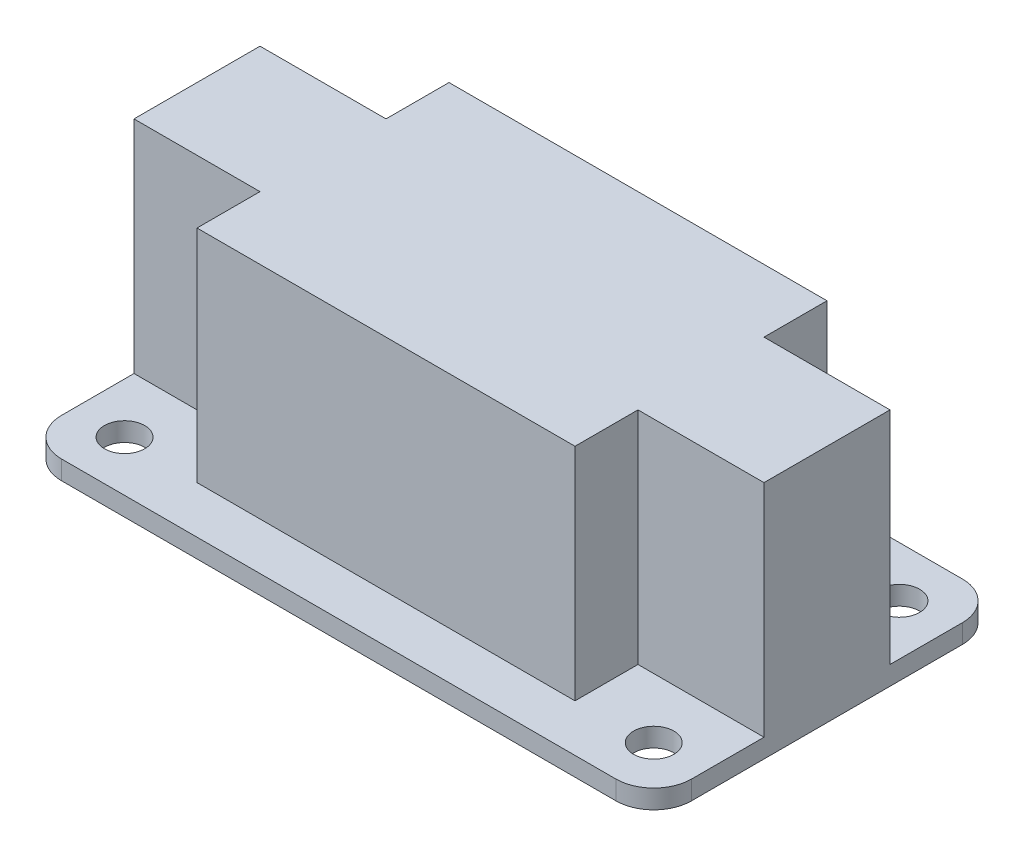
ISO-10303-21;
HEADER;
FILE_DESCRIPTION(('STEP AP214'),'2;1');
FILE_NAME('part.step','',(''),(''),'','','');
FILE_SCHEMA(('AUTOMOTIVE_DESIGN { 1 0 10303 214 1 1 1 1 }'));
ENDSEC;
DATA;
#1=APPLICATION_CONTEXT('core data for automotive mechanical design processes');
#2=APPLICATION_PROTOCOL_DEFINITION('international standard','automotive_design',2000,#1);
#3=PRODUCT_CONTEXT('',#1,'mechanical');
#4=PRODUCT('Part','Part','',(#3));
#5=PRODUCT_RELATED_PRODUCT_CATEGORY('part','',(#4));
#6=PRODUCT_DEFINITION_FORMATION('','',#4);
#7=PRODUCT_DEFINITION_CONTEXT('part definition',#1,'design');
#8=PRODUCT_DEFINITION('design','',#6,#7);
#9=PRODUCT_DEFINITION_SHAPE('','',#8);
#10=(LENGTH_UNIT() NAMED_UNIT(*) SI_UNIT(.MILLI.,.METRE.));
#11=(NAMED_UNIT(*) PLANE_ANGLE_UNIT() SI_UNIT($,.RADIAN.));
#12=(NAMED_UNIT(*) SI_UNIT($,.STERADIAN.) SOLID_ANGLE_UNIT());
#13=UNCERTAINTY_MEASURE_WITH_UNIT(LENGTH_MEASURE(1.E-05),#10,'distance_accuracy_value','');
#14=(GEOMETRIC_REPRESENTATION_CONTEXT(3) GLOBAL_UNCERTAINTY_ASSIGNED_CONTEXT((#13)) GLOBAL_UNIT_ASSIGNED_CONTEXT((#10,
#11,#12)) REPRESENTATION_CONTEXT('',''));
#15=CARTESIAN_POINT('',(0.,0.,0.));
#16=DIRECTION('',(0.,0.,1.));
#17=DIRECTION('',(1.,0.,0.));
#18=AXIS2_PLACEMENT_3D('',#15,#16,#17);
#19=CARTESIAN_POINT('',(0.,1.5,0.));
#20=DIRECTION('',(0.,1.,0.));
#21=DIRECTION('',(0.,0.,1.));
#22=AXIS2_PLACEMENT_3D('',#19,#20,#21);
#23=PLANE('',#22);
#24=DIRECTION('',(1.,0.,0.));
#25=VECTOR('',#24,1.);
#26=CARTESIAN_POINT('',(0.,1.5,-8.75));
#27=LINE('',#26,#25);
#28=CARTESIAN_POINT('',(0.,1.5,-8.75));
#29=VERTEX_POINT('',#28);
#30=CARTESIAN_POINT('',(10.,1.5,-8.75));
#31=VERTEX_POINT('',#30);
#32=EDGE_CURVE('E273',#29,#31,#27,.T.);
#33=ORIENTED_EDGE('',*,*,#32,.F.);
#34=DIRECTION('',(0.,0.,-1.));
#35=VECTOR('',#34,1.);
#36=CARTESIAN_POINT('',(0.,1.5,0.));
#37=LINE('',#36,#35);
#38=CARTESIAN_POINT('',(0.,1.5,-3.));
#39=VERTEX_POINT('',#38);
#40=EDGE_CURVE('E184',#39,#29,#37,.T.);
#41=ORIENTED_EDGE('',*,*,#40,.F.);
#42=CARTESIAN_POINT('',(3.,1.5,-3.));
#43=DIRECTION('',(0.,1.,0.));
#44=DIRECTION('',(0.,0.,1.));
#45=AXIS2_PLACEMENT_3D('',#42,#43,#44);
#46=CIRCLE('',#45,3.);
#47=CARTESIAN_POINT('',(3.,1.5,0.));
#48=VERTEX_POINT('',#47);
#49=EDGE_CURVE('E343',#39,#48,#46,.T.);
#50=ORIENTED_EDGE('',*,*,#49,.T.);
#51=DIRECTION('',(1.,0.,0.));
#52=VECTOR('',#51,1.);
#53=CARTESIAN_POINT('',(0.,1.5,0.));
#54=LINE('',#53,#52);
#55=CARTESIAN_POINT('',(47.,1.5,0.));
#56=VERTEX_POINT('',#55);
#57=EDGE_CURVE('E289',#48,#56,#54,.T.);
#58=ORIENTED_EDGE('',*,*,#57,.T.);
#59=CARTESIAN_POINT('',(47.,1.5,-3.));
#60=DIRECTION('',(0.,1.,0.));
#61=DIRECTION('',(0.,0.,1.));
#62=AXIS2_PLACEMENT_3D('',#59,#60,#61);
#63=CIRCLE('',#62,3.);
#64=CARTESIAN_POINT('',(50.,1.5,-3.));
#65=VERTEX_POINT('',#64);
#66=EDGE_CURVE('E339',#56,#65,#63,.T.);
#67=ORIENTED_EDGE('',*,*,#66,.T.);
#68=DIRECTION('',(0.,0.,-1.));
#69=VECTOR('',#68,1.);
#70=CARTESIAN_POINT('',(50.,1.5,0.));
#71=LINE('',#70,#69);
#72=CARTESIAN_POINT('',(50.,1.5,-8.75));
#73=VERTEX_POINT('',#72);
#74=EDGE_CURVE('E292',#65,#73,#71,.T.);
#75=ORIENTED_EDGE('',*,*,#74,.T.);
#76=DIRECTION('',(-1.,0.,0.));
#77=VECTOR('',#76,1.);
#78=CARTESIAN_POINT('',(0.,1.5,-8.75));
#79=LINE('',#78,#77);
#80=CARTESIAN_POINT('',(40.,1.5,-8.75));
#81=VERTEX_POINT('',#80);
#82=EDGE_CURVE('E263',#73,#81,#79,.T.);
#83=ORIENTED_EDGE('',*,*,#82,.T.);
#84=DIRECTION('',(0.,0.,1.));
#85=VECTOR('',#84,1.);
#86=CARTESIAN_POINT('',(40.,1.5,0.));
#87=LINE('',#86,#85);
#88=CARTESIAN_POINT('',(40.,1.5,-3.75));
#89=VERTEX_POINT('',#88);
#90=EDGE_CURVE('E266',#81,#89,#87,.T.);
#91=ORIENTED_EDGE('',*,*,#90,.T.);
#92=DIRECTION('',(1.,0.,0.));
#93=VECTOR('',#92,1.);
#94=CARTESIAN_POINT('',(0.,1.5,-3.75));
#95=LINE('',#94,#93);
#96=CARTESIAN_POINT('',(10.,1.5,-3.75));
#97=VERTEX_POINT('',#96);
#98=EDGE_CURVE('E269',#97,#89,#95,.T.);
#99=ORIENTED_EDGE('',*,*,#98,.F.);
#100=DIRECTION('',(0.,0.,1.));
#101=VECTOR('',#100,1.);
#102=CARTESIAN_POINT('',(10.,1.5,0.));
#103=LINE('',#102,#101);
#104=EDGE_CURVE('E271',#31,#97,#103,.T.);
#105=ORIENTED_EDGE('',*,*,#104,.F.);
#106=EDGE_LOOP('',(#33,#41,#50,#58,#67,#75,#83,#91,#99,#105));
#107=FACE_BOUND('',#106,.T.);
#108=CARTESIAN_POINT('',(46.,1.5,-4.));
#109=DIRECTION('',(0.,1.,0.));
#110=DIRECTION('',(0.,0.,1.));
#111=AXIS2_PLACEMENT_3D('',#108,#109,#110);
#112=CIRCLE('',#111,1.6);
#113=CARTESIAN_POINT('',(46.,1.5,-2.4));
#114=VERTEX_POINT('',#113);
#115=EDGE_CURVE('E286',#114,#114,#112,.T.);
#116=ORIENTED_EDGE('',*,*,#115,.F.);
#117=EDGE_LOOP('',(#116));
#118=FACE_BOUND('',#117,.T.);
#119=CARTESIAN_POINT('',(4.,1.5,-4.));
#120=DIRECTION('',(0.,1.,0.));
#121=DIRECTION('',(0.,0.,1.));
#122=AXIS2_PLACEMENT_3D('',#119,#120,#121);
#123=CIRCLE('',#122,1.6);
#124=CARTESIAN_POINT('',(4.,1.5,-2.4));
#125=VERTEX_POINT('',#124);
#126=EDGE_CURVE('E283',#125,#125,#123,.T.);
#127=ORIENTED_EDGE('',*,*,#126,.F.);
#128=EDGE_LOOP('',(#127));
#129=FACE_BOUND('',#128,.T.);
#130=ADVANCED_FACE('F41',(#107,#118,#129),#23,.T.);
#131=CARTESIAN_POINT('',(0.,1.5,0.));
#132=DIRECTION('',(0.,0.,-1.));
#133=DIRECTION('',(-1.,0.,0.));
#134=AXIS2_PLACEMENT_3D('',#131,#132,#133);
#135=PLANE('',#134);
#136=ORIENTED_EDGE('',*,*,#57,.F.);
#137=DIRECTION('',(0.,-1.,0.));
#138=VECTOR('',#137,1.);
#139=CARTESIAN_POINT('',(3.,0.,0.));
#140=LINE('',#139,#138);
#141=CARTESIAN_POINT('',(3.,0.,0.));
#142=VERTEX_POINT('',#141);
#143=EDGE_CURVE('E350',#48,#142,#140,.T.);
#144=ORIENTED_EDGE('',*,*,#143,.T.);
#145=DIRECTION('',(1.,0.,0.));
#146=VECTOR('',#145,1.);
#147=CARTESIAN_POINT('',(0.,0.,0.));
#148=LINE('',#147,#146);
#149=CARTESIAN_POINT('',(47.,0.,0.));
#150=VERTEX_POINT('',#149);
#151=EDGE_CURVE('E312',#142,#150,#148,.T.);
#152=ORIENTED_EDGE('',*,*,#151,.T.);
#153=DIRECTION('',(0.,-1.,0.));
#154=VECTOR('',#153,1.);
#155=CARTESIAN_POINT('',(47.,1.5,0.));
#156=LINE('',#155,#154);
#157=EDGE_CURVE('E348',#150,#56,#156,.F.);
#158=ORIENTED_EDGE('',*,*,#157,.T.);
#159=EDGE_LOOP('',(#136,#144,#152,#158));
#160=FACE_BOUND('',#159,.T.);
#161=ADVANCED_FACE('F389',(#160),#135,.F.);
#162=CARTESIAN_POINT('',(50.,1.5,0.));
#163=DIRECTION('',(-1.,0.,0.));
#164=DIRECTION('',(0.,0.,1.));
#165=AXIS2_PLACEMENT_3D('',#162,#163,#164);
#166=PLANE('',#165);
#167=CARTESIAN_POINT('',(50.,1.5,-18.75));
#168=VERTEX_POINT('',#167);
#169=CARTESIAN_POINT('',(50.,1.5,-24.5));
#170=VERTEX_POINT('',#169);
#171=EDGE_CURVE('E64',#168,#170,#71,.T.);
#172=ORIENTED_EDGE('',*,*,#171,.F.);
#173=DIRECTION('',(0.,-1.,0.));
#174=VECTOR('',#173,1.);
#175=CARTESIAN_POINT('',(50.,19.,-18.75));
#176=LINE('',#175,#174);
#177=CARTESIAN_POINT('',(50.,19.,-18.75));
#178=VERTEX_POINT('',#177);
#179=EDGE_CURVE('E236',#178,#168,#176,.T.);
#180=ORIENTED_EDGE('',*,*,#179,.F.);
#181=DIRECTION('',(0.,0.,-1.));
#182=VECTOR('',#181,1.);
#183=CARTESIAN_POINT('',(50.,19.,0.));
#184=LINE('',#183,#182);
#185=CARTESIAN_POINT('',(50.,19.,-8.75));
#186=VERTEX_POINT('',#185);
#187=EDGE_CURVE('E216',#186,#178,#184,.T.);
#188=ORIENTED_EDGE('',*,*,#187,.F.);
#189=DIRECTION('',(0.,-1.,0.));
#190=VECTOR('',#189,1.);
#191=CARTESIAN_POINT('',(50.,19.,-8.75));
#192=LINE('',#191,#190);
#193=EDGE_CURVE('E238',#186,#73,#192,.T.);
#194=ORIENTED_EDGE('',*,*,#193,.T.);
#195=ORIENTED_EDGE('',*,*,#74,.F.);
#196=DIRECTION('',(0.,-1.,0.));
#197=VECTOR('',#196,1.);
#198=CARTESIAN_POINT('',(50.,1.5,-3.));
#199=LINE('',#198,#197);
#200=CARTESIAN_POINT('',(50.,0.,-3.));
#201=VERTEX_POINT('',#200);
#202=EDGE_CURVE('E49',#65,#201,#199,.T.);
#203=ORIENTED_EDGE('',*,*,#202,.T.);
#204=DIRECTION('',(0.,0.,-1.));
#205=VECTOR('',#204,1.);
#206=CARTESIAN_POINT('',(50.,0.,0.));
#207=LINE('',#206,#205);
#208=CARTESIAN_POINT('',(50.,0.,-24.5));
#209=VERTEX_POINT('',#208);
#210=EDGE_CURVE('E315',#201,#209,#207,.T.);
#211=ORIENTED_EDGE('',*,*,#210,.T.);
#212=DIRECTION('',(0.,-1.,0.));
#213=VECTOR('',#212,1.);
#214=CARTESIAN_POINT('',(50.,1.5,-24.5));
#215=LINE('',#214,#213);
#216=EDGE_CURVE('E11',#209,#170,#215,.F.);
#217=ORIENTED_EDGE('',*,*,#216,.T.);
#218=EDGE_LOOP('',(#172,#180,#188,#194,#195,#203,#211,#217));
#219=FACE_BOUND('',#218,.T.);
#220=ADVANCED_FACE('F357',(#219),#166,.F.);
#221=CARTESIAN_POINT('',(0.,1.5,-27.5));
#222=DIRECTION('',(0.,0.,-1.));
#223=DIRECTION('',(-1.,0.,0.));
#224=AXIS2_PLACEMENT_3D('',#221,#222,#223);
#225=PLANE('',#224);
#226=DIRECTION('',(1.,0.,0.));
#227=VECTOR('',#226,1.);
#228=CARTESIAN_POINT('',(0.,0.,-27.5));
#229=LINE('',#228,#227);
#230=CARTESIAN_POINT('',(3.,0.,-27.5));
#231=VERTEX_POINT('',#230);
#232=CARTESIAN_POINT('',(47.,0.,-27.5));
#233=VERTEX_POINT('',#232);
#234=EDGE_CURVE('E317',#231,#233,#229,.T.);
#235=ORIENTED_EDGE('',*,*,#234,.F.);
#236=DIRECTION('',(0.,-1.,0.));
#237=VECTOR('',#236,1.);
#238=CARTESIAN_POINT('',(3.,1.5,-27.5));
#239=LINE('',#238,#237);
#240=CARTESIAN_POINT('',(3.,1.5,-27.5));
#241=VERTEX_POINT('',#240);
#242=EDGE_CURVE('E337',#231,#241,#239,.F.);
#243=ORIENTED_EDGE('',*,*,#242,.T.);
#244=DIRECTION('',(1.,0.,0.));
#245=VECTOR('',#244,1.);
#246=CARTESIAN_POINT('',(0.,1.5,-27.5));
#247=LINE('',#246,#245);
#248=CARTESIAN_POINT('',(47.,1.5,-27.5));
#249=VERTEX_POINT('',#248);
#250=EDGE_CURVE('E295',#241,#249,#247,.T.);
#251=ORIENTED_EDGE('',*,*,#250,.T.);
#252=DIRECTION('',(0.,-1.,0.));
#253=VECTOR('',#252,1.);
#254=CARTESIAN_POINT('',(47.,0.,-27.5));
#255=LINE('',#254,#253);
#256=EDGE_CURVE('E334',#249,#233,#255,.T.);
#257=ORIENTED_EDGE('',*,*,#256,.T.);
#258=EDGE_LOOP('',(#235,#243,#251,#257));
#259=FACE_BOUND('',#258,.T.);
#260=ADVANCED_FACE('F463',(#259),#225,.T.);
#261=CARTESIAN_POINT('',(46.,1.5,-4.));
#262=DIRECTION('',(0.,-1.,0.));
#263=DIRECTION('',(0.,0.,-1.));
#264=AXIS2_PLACEMENT_3D('',#261,#262,#263);
#265=CYLINDRICAL_SURFACE('',#264,1.6);
#266=ORIENTED_EDGE('',*,*,#115,.T.);
#267=EDGE_LOOP('',(#266));
#268=FACE_BOUND('',#267,.T.);
#269=CARTESIAN_POINT('',(46.,0.,-4.));
#270=DIRECTION('',(0.,1.,0.));
#271=DIRECTION('',(0.,0.,1.));
#272=AXIS2_PLACEMENT_3D('',#269,#270,#271);
#273=CIRCLE('',#272,1.6);
#274=CARTESIAN_POINT('',(46.,0.,-2.4));
#275=VERTEX_POINT('',#274);
#276=EDGE_CURVE('E309',#275,#275,#273,.T.);
#277=ORIENTED_EDGE('',*,*,#276,.F.);
#278=EDGE_LOOP('',(#277));
#279=FACE_BOUND('',#278,.T.);
#280=ADVANCED_FACE('F457',(#268,#279),#265,.F.);
#281=CARTESIAN_POINT('',(4.,1.5,-4.));
#282=DIRECTION('',(0.,-1.,0.));
#283=DIRECTION('',(0.,0.,-1.));
#284=AXIS2_PLACEMENT_3D('',#281,#282,#283);
#285=CYLINDRICAL_SURFACE('',#284,1.6);
#286=ORIENTED_EDGE('',*,*,#126,.T.);
#287=EDGE_LOOP('',(#286));
#288=FACE_BOUND('',#287,.T.);
#289=CARTESIAN_POINT('',(4.,0.,-4.));
#290=DIRECTION('',(0.,1.,0.));
#291=DIRECTION('',(0.,0.,1.));
#292=AXIS2_PLACEMENT_3D('',#289,#290,#291);
#293=CIRCLE('',#292,1.6);
#294=CARTESIAN_POINT('',(4.,0.,-2.4));
#295=VERTEX_POINT('',#294);
#296=EDGE_CURVE('E306',#295,#295,#293,.T.);
#297=ORIENTED_EDGE('',*,*,#296,.F.);
#298=EDGE_LOOP('',(#297));
#299=FACE_BOUND('',#298,.T.);
#300=ADVANCED_FACE('F447',(#288,#299),#285,.F.);
#301=CARTESIAN_POINT('',(46.,1.5,-23.5));
#302=DIRECTION('',(0.,-1.,0.));
#303=DIRECTION('',(0.,0.,-1.));
#304=AXIS2_PLACEMENT_3D('',#301,#302,#303);
#305=CYLINDRICAL_SURFACE('',#304,1.6);
#306=CARTESIAN_POINT('',(46.,1.5,-23.5));
#307=DIRECTION('',(0.,1.,0.));
#308=DIRECTION('',(0.,0.,1.));
#309=AXIS2_PLACEMENT_3D('',#306,#307,#308);
#310=CIRCLE('',#309,1.6);
#311=CARTESIAN_POINT('',(46.,1.5,-21.9));
#312=VERTEX_POINT('',#311);
#313=EDGE_CURVE('E279',#312,#312,#310,.T.);
#314=ORIENTED_EDGE('',*,*,#313,.T.);
#315=EDGE_LOOP('',(#314));
#316=FACE_BOUND('',#315,.T.);
#317=CARTESIAN_POINT('',(46.,0.,-23.5));
#318=DIRECTION('',(0.,1.,0.));
#319=DIRECTION('',(0.,0.,1.));
#320=AXIS2_PLACEMENT_3D('',#317,#318,#319);
#321=CIRCLE('',#320,1.6);
#322=CARTESIAN_POINT('',(46.,0.,-21.9));
#323=VERTEX_POINT('',#322);
#324=EDGE_CURVE('E303',#323,#323,#321,.T.);
#325=ORIENTED_EDGE('',*,*,#324,.F.);
#326=EDGE_LOOP('',(#325));
#327=FACE_BOUND('',#326,.T.);
#328=ADVANCED_FACE('F444',(#316,#327),#305,.F.);
#329=CARTESIAN_POINT('',(4.,1.5,-23.5));
#330=DIRECTION('',(0.,-1.,0.));
#331=DIRECTION('',(0.,0.,-1.));
#332=AXIS2_PLACEMENT_3D('',#329,#330,#331);
#333=CYLINDRICAL_SURFACE('',#332,1.6);
#334=CARTESIAN_POINT('',(4.,1.5,-23.5));
#335=DIRECTION('',(0.,1.,0.));
#336=DIRECTION('',(0.,0.,1.));
#337=AXIS2_PLACEMENT_3D('',#334,#335,#336);
#338=CIRCLE('',#337,1.6);
#339=CARTESIAN_POINT('',(4.,1.5,-21.9));
#340=VERTEX_POINT('',#339);
#341=EDGE_CURVE('E276',#340,#340,#338,.T.);
#342=ORIENTED_EDGE('',*,*,#341,.T.);
#343=EDGE_LOOP('',(#342));
#344=FACE_BOUND('',#343,.T.);
#345=CARTESIAN_POINT('',(4.,0.,-23.5));
#346=DIRECTION('',(0.,1.,0.));
#347=DIRECTION('',(0.,0.,1.));
#348=AXIS2_PLACEMENT_3D('',#345,#346,#347);
#349=CIRCLE('',#348,1.6);
#350=CARTESIAN_POINT('',(4.,0.,-21.9));
#351=VERTEX_POINT('',#350);
#352=EDGE_CURVE('E275',#351,#351,#349,.T.);
#353=ORIENTED_EDGE('',*,*,#352,.F.);
#354=EDGE_LOOP('',(#353));
#355=FACE_BOUND('',#354,.T.);
#356=ADVANCED_FACE('F437',(#344,#355),#333,.F.);
#357=CARTESIAN_POINT('',(0.,1.5,0.));
#358=DIRECTION('',(-1.,0.,0.));
#359=DIRECTION('',(0.,0.,1.));
#360=AXIS2_PLACEMENT_3D('',#357,#358,#359);
#361=PLANE('',#360);
#362=ORIENTED_EDGE('',*,*,#40,.T.);
#363=DIRECTION('',(0.,-1.,0.));
#364=VECTOR('',#363,1.);
#365=CARTESIAN_POINT('',(0.,19.,-8.75));
#366=LINE('',#365,#364);
#367=CARTESIAN_POINT('',(0.,19.,-8.75));
#368=VERTEX_POINT('',#367);
#369=EDGE_CURVE('E178',#368,#29,#366,.T.);
#370=ORIENTED_EDGE('',*,*,#369,.F.);
#371=DIRECTION('',(0.,0.,-1.));
#372=VECTOR('',#371,1.);
#373=CARTESIAN_POINT('',(0.,19.,0.));
#374=LINE('',#373,#372);
#375=CARTESIAN_POINT('',(0.,19.,-18.75));
#376=VERTEX_POINT('',#375);
#377=EDGE_CURVE('E182',#368,#376,#374,.T.);
#378=ORIENTED_EDGE('',*,*,#377,.T.);
#379=DIRECTION('',(0.,-1.,0.));
#380=VECTOR('',#379,1.);
#381=CARTESIAN_POINT('',(0.,19.,-18.75));
#382=LINE('',#381,#380);
#383=CARTESIAN_POINT('',(0.,1.5,-18.75));
#384=VERTEX_POINT('',#383);
#385=EDGE_CURVE('E224',#376,#384,#382,.T.);
#386=ORIENTED_EDGE('',*,*,#385,.T.);
#387=CARTESIAN_POINT('',(0.,1.5,-24.5));
#388=VERTEX_POINT('',#387);
#389=EDGE_CURVE('E298',#384,#388,#37,.T.);
#390=ORIENTED_EDGE('',*,*,#389,.T.);
#391=DIRECTION('',(0.,-1.,0.));
#392=VECTOR('',#391,1.);
#393=CARTESIAN_POINT('',(0.,1.5,-24.5));
#394=LINE('',#393,#392);
#395=CARTESIAN_POINT('',(0.,0.,-24.5));
#396=VERTEX_POINT('',#395);
#397=EDGE_CURVE('E322',#388,#396,#394,.T.);
#398=ORIENTED_EDGE('',*,*,#397,.T.);
#399=DIRECTION('',(0.,0.,-1.));
#400=VECTOR('',#399,1.);
#401=CARTESIAN_POINT('',(0.,0.,0.));
#402=LINE('',#401,#400);
#403=CARTESIAN_POINT('',(0.,0.,-3.));
#404=VERTEX_POINT('',#403);
#405=EDGE_CURVE('E280',#404,#396,#402,.T.);
#406=ORIENTED_EDGE('',*,*,#405,.F.);
#407=DIRECTION('',(0.,-1.,0.));
#408=VECTOR('',#407,1.);
#409=CARTESIAN_POINT('',(0.,1.5,-3.));
#410=LINE('',#409,#408);
#411=EDGE_CURVE('E300',#404,#39,#410,.F.);
#412=ORIENTED_EDGE('',*,*,#411,.T.);
#413=EDGE_LOOP('',(#362,#370,#378,#386,#390,#398,#406,#412));
#414=FACE_BOUND('',#413,.T.);
#415=ADVANCED_FACE('F180',(#414),#361,.T.);
#416=DIRECTION('',(-1.,0.,0.));
#417=VECTOR('',#416,1.);
#418=CARTESIAN_POINT('',(0.,1.5,-18.75));
#419=LINE('',#418,#417);
#420=CARTESIAN_POINT('',(40.,1.5,-18.75));
#421=VERTEX_POINT('',#420);
#422=EDGE_CURVE('E261',#168,#421,#419,.T.);
#423=ORIENTED_EDGE('',*,*,#422,.F.);
#424=ORIENTED_EDGE('',*,*,#171,.T.);
#425=CARTESIAN_POINT('',(47.,1.5,-24.5));
#426=DIRECTION('',(0.,1.,0.));
#427=DIRECTION('',(0.,0.,1.));
#428=AXIS2_PLACEMENT_3D('',#425,#426,#427);
#429=CIRCLE('',#428,3.);
#430=EDGE_CURVE('E341',#170,#249,#429,.T.);
#431=ORIENTED_EDGE('',*,*,#430,.T.);
#432=ORIENTED_EDGE('',*,*,#250,.F.);
#433=CARTESIAN_POINT('',(3.,1.5,-24.5));
#434=DIRECTION('',(0.,1.,0.));
#435=DIRECTION('',(0.,0.,1.));
#436=AXIS2_PLACEMENT_3D('',#433,#434,#435);
#437=CIRCLE('',#436,3.);
#438=EDGE_CURVE('E345',#241,#388,#437,.T.);
#439=ORIENTED_EDGE('',*,*,#438,.T.);
#440=ORIENTED_EDGE('',*,*,#389,.F.);
#441=DIRECTION('',(1.,0.,0.));
#442=VECTOR('',#441,1.);
#443=CARTESIAN_POINT('',(0.,1.5,-18.75));
#444=LINE('',#443,#442);
#445=CARTESIAN_POINT('',(10.,1.5,-18.75));
#446=VERTEX_POINT('',#445);
#447=EDGE_CURVE('E188',#384,#446,#444,.T.);
#448=ORIENTED_EDGE('',*,*,#447,.T.);
#449=DIRECTION('',(0.,0.,1.));
#450=VECTOR('',#449,1.);
#451=CARTESIAN_POINT('',(10.,1.5,0.));
#452=LINE('',#451,#450);
#453=CARTESIAN_POINT('',(10.,1.5,-23.75));
#454=VERTEX_POINT('',#453);
#455=EDGE_CURVE('E253',#454,#446,#452,.T.);
#456=ORIENTED_EDGE('',*,*,#455,.F.);
#457=DIRECTION('',(1.,0.,0.));
#458=VECTOR('',#457,1.);
#459=CARTESIAN_POINT('',(0.,1.5,-23.75));
#460=LINE('',#459,#458);
#461=CARTESIAN_POINT('',(40.,1.5,-23.75));
#462=VERTEX_POINT('',#461);
#463=EDGE_CURVE('E255',#454,#462,#460,.T.);
#464=ORIENTED_EDGE('',*,*,#463,.T.);
#465=DIRECTION('',(0.,0.,1.));
#466=VECTOR('',#465,1.);
#467=CARTESIAN_POINT('',(40.,1.5,0.));
#468=LINE('',#467,#466);
#469=EDGE_CURVE('E258',#462,#421,#468,.T.);
#470=ORIENTED_EDGE('',*,*,#469,.T.);
#471=EDGE_LOOP('',(#423,#424,#431,#432,#439,#440,#448,#456,#464,#470));
#472=FACE_BOUND('',#471,.T.);
#473=ORIENTED_EDGE('',*,*,#341,.F.);
#474=EDGE_LOOP('',(#473));
#475=FACE_BOUND('',#474,.T.);
#476=ORIENTED_EDGE('',*,*,#313,.F.);
#477=EDGE_LOOP('',(#476));
#478=FACE_BOUND('',#477,.T.);
#479=ADVANCED_FACE('F422',(#472,#475,#478),#23,.T.);
#480=CARTESIAN_POINT('',(0.,0.,0.));
#481=DIRECTION('',(0.,1.,0.));
#482=DIRECTION('',(0.,0.,1.));
#483=AXIS2_PLACEMENT_3D('',#480,#481,#482);
#484=PLANE('',#483);
#485=ORIENTED_EDGE('',*,*,#405,.T.);
#486=CARTESIAN_POINT('',(3.,0.,-24.5));
#487=DIRECTION('',(0.,1.,0.));
#488=DIRECTION('',(0.,0.,1.));
#489=AXIS2_PLACEMENT_3D('',#486,#487,#488);
#490=CIRCLE('',#489,3.);
#491=EDGE_CURVE('E332',#396,#231,#490,.F.);
#492=ORIENTED_EDGE('',*,*,#491,.T.);
#493=ORIENTED_EDGE('',*,*,#234,.T.);
#494=CARTESIAN_POINT('',(47.,0.,-24.5));
#495=DIRECTION('',(0.,1.,0.));
#496=DIRECTION('',(0.,0.,1.));
#497=AXIS2_PLACEMENT_3D('',#494,#495,#496);
#498=CIRCLE('',#497,3.);
#499=EDGE_CURVE('E327',#233,#209,#498,.F.);
#500=ORIENTED_EDGE('',*,*,#499,.T.);
#501=ORIENTED_EDGE('',*,*,#210,.F.);
#502=CARTESIAN_POINT('',(47.,0.,-3.));
#503=DIRECTION('',(0.,1.,0.));
#504=DIRECTION('',(0.,0.,1.));
#505=AXIS2_PLACEMENT_3D('',#502,#503,#504);
#506=CIRCLE('',#505,3.);
#507=EDGE_CURVE('E325',#201,#150,#506,.F.);
#508=ORIENTED_EDGE('',*,*,#507,.T.);
#509=ORIENTED_EDGE('',*,*,#151,.F.);
#510=CARTESIAN_POINT('',(3.,0.,-3.));
#511=DIRECTION('',(0.,1.,0.));
#512=DIRECTION('',(0.,0.,1.));
#513=AXIS2_PLACEMENT_3D('',#510,#511,#512);
#514=CIRCLE('',#513,3.);
#515=EDGE_CURVE('E330',#142,#404,#514,.F.);
#516=ORIENTED_EDGE('',*,*,#515,.T.);
#517=EDGE_LOOP('',(#485,#492,#493,#500,#501,#508,#509,#516));
#518=FACE_BOUND('',#517,.T.);
#519=ORIENTED_EDGE('',*,*,#352,.T.);
#520=EDGE_LOOP('',(#519));
#521=FACE_BOUND('',#520,.T.);
#522=ORIENTED_EDGE('',*,*,#324,.T.);
#523=EDGE_LOOP('',(#522));
#524=FACE_BOUND('',#523,.T.);
#525=ORIENTED_EDGE('',*,*,#276,.T.);
#526=EDGE_LOOP('',(#525));
#527=FACE_BOUND('',#526,.T.);
#528=ORIENTED_EDGE('',*,*,#296,.T.);
#529=EDGE_LOOP('',(#528));
#530=FACE_BOUND('',#529,.T.);
#531=ADVANCED_FACE('F361',(#518,#521,#524,#527,#530),#484,.F.);
#532=CARTESIAN_POINT('',(3.,1.5,-24.5));
#533=DIRECTION('',(0.,-1.,0.));
#534=DIRECTION('',(0.,0.,-1.));
#535=AXIS2_PLACEMENT_3D('',#532,#533,#534);
#536=CYLINDRICAL_SURFACE('',#535,3.);
#537=ORIENTED_EDGE('',*,*,#438,.F.);
#538=ORIENTED_EDGE('',*,*,#242,.F.);
#539=ORIENTED_EDGE('',*,*,#491,.F.);
#540=ORIENTED_EDGE('',*,*,#397,.F.);
#541=EDGE_LOOP('',(#537,#538,#539,#540));
#542=FACE_BOUND('',#541,.T.);
#543=ADVANCED_FACE('F436',(#542),#536,.T.);
#544=CARTESIAN_POINT('',(3.,1.5,-3.));
#545=DIRECTION('',(0.,1.,0.));
#546=DIRECTION('',(0.,0.,1.));
#547=AXIS2_PLACEMENT_3D('',#544,#545,#546);
#548=CYLINDRICAL_SURFACE('',#547,3.);
#549=ORIENTED_EDGE('',*,*,#49,.F.);
#550=ORIENTED_EDGE('',*,*,#411,.F.);
#551=ORIENTED_EDGE('',*,*,#515,.F.);
#552=ORIENTED_EDGE('',*,*,#143,.F.);
#553=EDGE_LOOP('',(#549,#550,#551,#552));
#554=FACE_BOUND('',#553,.T.);
#555=ADVANCED_FACE('F397',(#554),#548,.T.);
#556=CARTESIAN_POINT('',(47.,1.5,-24.5));
#557=DIRECTION('',(0.,1.,0.));
#558=DIRECTION('',(0.,0.,1.));
#559=AXIS2_PLACEMENT_3D('',#556,#557,#558);
#560=CYLINDRICAL_SURFACE('',#559,3.);
#561=ORIENTED_EDGE('',*,*,#430,.F.);
#562=ORIENTED_EDGE('',*,*,#216,.F.);
#563=ORIENTED_EDGE('',*,*,#499,.F.);
#564=ORIENTED_EDGE('',*,*,#256,.F.);
#565=EDGE_LOOP('',(#561,#562,#563,#564));
#566=FACE_BOUND('',#565,.T.);
#567=ADVANCED_FACE('F369',(#566),#560,.T.);
#568=CARTESIAN_POINT('',(47.,1.5,-3.));
#569=DIRECTION('',(0.,-1.,0.));
#570=DIRECTION('',(0.,0.,-1.));
#571=AXIS2_PLACEMENT_3D('',#568,#569,#570);
#572=CYLINDRICAL_SURFACE('',#571,3.);
#573=ORIENTED_EDGE('',*,*,#66,.F.);
#574=ORIENTED_EDGE('',*,*,#157,.F.);
#575=ORIENTED_EDGE('',*,*,#507,.F.);
#576=ORIENTED_EDGE('',*,*,#202,.F.);
#577=EDGE_LOOP('',(#573,#574,#575,#576));
#578=FACE_BOUND('',#577,.T.);
#579=ADVANCED_FACE('F43',(#578),#572,.T.);
#580=CARTESIAN_POINT('',(0.,19.,-8.75));
#581=DIRECTION('',(0.,0.,1.));
#582=DIRECTION('',(1.,0.,0.));
#583=AXIS2_PLACEMENT_3D('',#580,#581,#582);
#584=PLANE('',#583);
#585=ORIENTED_EDGE('',*,*,#369,.T.);
#586=ORIENTED_EDGE('',*,*,#32,.T.);
#587=DIRECTION('',(0.,-1.,0.));
#588=VECTOR('',#587,1.);
#589=CARTESIAN_POINT('',(10.,19.,-8.75));
#590=LINE('',#589,#588);
#591=CARTESIAN_POINT('',(10.,19.,-8.75));
#592=VERTEX_POINT('',#591);
#593=EDGE_CURVE('E189',#592,#31,#590,.T.);
#594=ORIENTED_EDGE('',*,*,#593,.F.);
#595=DIRECTION('',(-1.,0.,0.));
#596=VECTOR('',#595,1.);
#597=CARTESIAN_POINT('',(0.,19.,-8.75));
#598=LINE('',#597,#596);
#599=EDGE_CURVE('E195',#592,#368,#598,.T.);
#600=ORIENTED_EDGE('',*,*,#599,.T.);
#601=EDGE_LOOP('',(#585,#586,#594,#600));
#602=FACE_BOUND('',#601,.T.);
#603=ADVANCED_FACE('F201',(#602),#584,.T.);
#604=CARTESIAN_POINT('',(10.,19.,0.));
#605=DIRECTION('',(-1.,0.,0.));
#606=DIRECTION('',(0.,0.,1.));
#607=AXIS2_PLACEMENT_3D('',#604,#605,#606);
#608=PLANE('',#607);
#609=ORIENTED_EDGE('',*,*,#593,.T.);
#610=ORIENTED_EDGE('',*,*,#104,.T.);
#611=DIRECTION('',(0.,-1.,0.));
#612=VECTOR('',#611,1.);
#613=CARTESIAN_POINT('',(10.,19.,-3.75));
#614=LINE('',#613,#612);
#615=CARTESIAN_POINT('',(10.,19.,-3.75));
#616=VERTEX_POINT('',#615);
#617=EDGE_CURVE('E247',#616,#97,#614,.T.);
#618=ORIENTED_EDGE('',*,*,#617,.F.);
#619=DIRECTION('',(0.,0.,-1.));
#620=VECTOR('',#619,1.);
#621=CARTESIAN_POINT('',(10.,19.,0.));
#622=LINE('',#621,#620);
#623=EDGE_CURVE('E203',#616,#592,#622,.T.);
#624=ORIENTED_EDGE('',*,*,#623,.T.);
#625=EDGE_LOOP('',(#609,#610,#618,#624));
#626=FACE_BOUND('',#625,.T.);
#627=ADVANCED_FACE('F401',(#626),#608,.T.);
#628=CARTESIAN_POINT('',(0.,19.,-3.75));
#629=DIRECTION('',(0.,0.,1.));
#630=DIRECTION('',(1.,0.,0.));
#631=AXIS2_PLACEMENT_3D('',#628,#629,#630);
#632=PLANE('',#631);
#633=ORIENTED_EDGE('',*,*,#617,.T.);
#634=ORIENTED_EDGE('',*,*,#98,.T.);
#635=DIRECTION('',(0.,-1.,0.));
#636=VECTOR('',#635,1.);
#637=CARTESIAN_POINT('',(40.,19.,-3.75));
#638=LINE('',#637,#636);
#639=CARTESIAN_POINT('',(40.,19.,-3.75));
#640=VERTEX_POINT('',#639);
#641=EDGE_CURVE('E244',#640,#89,#638,.T.);
#642=ORIENTED_EDGE('',*,*,#641,.F.);
#643=DIRECTION('',(-1.,0.,0.));
#644=VECTOR('',#643,1.);
#645=CARTESIAN_POINT('',(0.,19.,-3.75));
#646=LINE('',#645,#644);
#647=EDGE_CURVE('E205',#640,#616,#646,.T.);
#648=ORIENTED_EDGE('',*,*,#647,.T.);
#649=EDGE_LOOP('',(#633,#634,#642,#648));
#650=FACE_BOUND('',#649,.T.);
#651=ADVANCED_FACE('F403',(#650),#632,.T.);
#652=CARTESIAN_POINT('',(40.,19.,0.));
#653=DIRECTION('',(-1.,0.,0.));
#654=DIRECTION('',(0.,0.,1.));
#655=AXIS2_PLACEMENT_3D('',#652,#653,#654);
#656=PLANE('',#655);
#657=ORIENTED_EDGE('',*,*,#90,.F.);
#658=DIRECTION('',(0.,-1.,0.));
#659=VECTOR('',#658,1.);
#660=CARTESIAN_POINT('',(40.,19.,-8.75));
#661=LINE('',#660,#659);
#662=CARTESIAN_POINT('',(40.,19.,-8.75));
#663=VERTEX_POINT('',#662);
#664=EDGE_CURVE('E241',#663,#81,#661,.T.);
#665=ORIENTED_EDGE('',*,*,#664,.F.);
#666=DIRECTION('',(0.,0.,-1.));
#667=VECTOR('',#666,1.);
#668=CARTESIAN_POINT('',(40.,19.,0.));
#669=LINE('',#668,#667);
#670=EDGE_CURVE('E211',#640,#663,#669,.T.);
#671=ORIENTED_EDGE('',*,*,#670,.F.);
#672=ORIENTED_EDGE('',*,*,#641,.T.);
#673=EDGE_LOOP('',(#657,#665,#671,#672));
#674=FACE_BOUND('',#673,.T.);
#675=ADVANCED_FACE('F405',(#674),#656,.F.);
#676=CARTESIAN_POINT('',(0.,19.,-8.75));
#677=DIRECTION('',(0.,0.,-1.));
#678=DIRECTION('',(-1.,0.,0.));
#679=AXIS2_PLACEMENT_3D('',#676,#677,#678);
#680=PLANE('',#679);
#681=ORIENTED_EDGE('',*,*,#82,.F.);
#682=ORIENTED_EDGE('',*,*,#193,.F.);
#683=DIRECTION('',(1.,0.,0.));
#684=VECTOR('',#683,1.);
#685=CARTESIAN_POINT('',(0.,19.,-8.75));
#686=LINE('',#685,#684);
#687=EDGE_CURVE('E213',#663,#186,#686,.T.);
#688=ORIENTED_EDGE('',*,*,#687,.F.);
#689=ORIENTED_EDGE('',*,*,#664,.T.);
#690=EDGE_LOOP('',(#681,#682,#688,#689));
#691=FACE_BOUND('',#690,.T.);
#692=ADVANCED_FACE('F383',(#691),#680,.F.);
#693=CARTESIAN_POINT('',(0.,19.,-18.75));
#694=DIRECTION('',(0.,0.,-1.));
#695=DIRECTION('',(-1.,0.,0.));
#696=AXIS2_PLACEMENT_3D('',#693,#694,#695);
#697=PLANE('',#696);
#698=ORIENTED_EDGE('',*,*,#179,.T.);
#699=ORIENTED_EDGE('',*,*,#422,.T.);
#700=DIRECTION('',(0.,-1.,0.));
#701=VECTOR('',#700,1.);
#702=CARTESIAN_POINT('',(40.,19.,-18.75));
#703=LINE('',#702,#701);
#704=CARTESIAN_POINT('',(40.,19.,-18.75));
#705=VERTEX_POINT('',#704);
#706=EDGE_CURVE('E233',#705,#421,#703,.T.);
#707=ORIENTED_EDGE('',*,*,#706,.F.);
#708=DIRECTION('',(1.,0.,0.));
#709=VECTOR('',#708,1.);
#710=CARTESIAN_POINT('',(0.,19.,-18.75));
#711=LINE('',#710,#709);
#712=EDGE_CURVE('E218',#705,#178,#711,.T.);
#713=ORIENTED_EDGE('',*,*,#712,.T.);
#714=EDGE_LOOP('',(#698,#699,#707,#713));
#715=FACE_BOUND('',#714,.T.);
#716=ADVANCED_FACE('F374',(#715),#697,.T.);
#717=ORIENTED_EDGE('',*,*,#469,.F.);
#718=DIRECTION('',(0.,-1.,0.));
#719=VECTOR('',#718,1.);
#720=CARTESIAN_POINT('',(40.,19.,-23.75));
#721=LINE('',#720,#719);
#722=CARTESIAN_POINT('',(40.,19.,-23.75));
#723=VERTEX_POINT('',#722);
#724=EDGE_CURVE('E230',#723,#462,#721,.T.);
#725=ORIENTED_EDGE('',*,*,#724,.F.);
#726=EDGE_CURVE('E214',#705,#723,#669,.T.);
#727=ORIENTED_EDGE('',*,*,#726,.F.);
#728=ORIENTED_EDGE('',*,*,#706,.T.);
#729=EDGE_LOOP('',(#717,#725,#727,#728));
#730=FACE_BOUND('',#729,.T.);
#731=ADVANCED_FACE('F408',(#730),#656,.F.);
#732=CARTESIAN_POINT('',(0.,19.,-23.75));
#733=DIRECTION('',(0.,0.,1.));
#734=DIRECTION('',(1.,0.,0.));
#735=AXIS2_PLACEMENT_3D('',#732,#733,#734);
#736=PLANE('',#735);
#737=ORIENTED_EDGE('',*,*,#463,.F.);
#738=DIRECTION('',(0.,-1.,0.));
#739=VECTOR('',#738,1.);
#740=CARTESIAN_POINT('',(10.,19.,-23.75));
#741=LINE('',#740,#739);
#742=CARTESIAN_POINT('',(10.,19.,-23.75));
#743=VERTEX_POINT('',#742);
#744=EDGE_CURVE('E227',#743,#454,#741,.T.);
#745=ORIENTED_EDGE('',*,*,#744,.F.);
#746=DIRECTION('',(-1.,0.,0.));
#747=VECTOR('',#746,1.);
#748=CARTESIAN_POINT('',(0.,19.,-23.75));
#749=LINE('',#748,#747);
#750=EDGE_CURVE('E221',#723,#743,#749,.T.);
#751=ORIENTED_EDGE('',*,*,#750,.F.);
#752=ORIENTED_EDGE('',*,*,#724,.T.);
#753=EDGE_LOOP('',(#737,#745,#751,#752));
#754=FACE_BOUND('',#753,.T.);
#755=ADVANCED_FACE('F418',(#754),#736,.F.);
#756=ORIENTED_EDGE('',*,*,#744,.T.);
#757=ORIENTED_EDGE('',*,*,#455,.T.);
#758=DIRECTION('',(0.,-1.,0.));
#759=VECTOR('',#758,1.);
#760=CARTESIAN_POINT('',(10.,19.,-18.75));
#761=LINE('',#760,#759);
#762=CARTESIAN_POINT('',(10.,19.,-18.75));
#763=VERTEX_POINT('',#762);
#764=EDGE_CURVE('E56',#763,#446,#761,.T.);
#765=ORIENTED_EDGE('',*,*,#764,.F.);
#766=EDGE_CURVE('E207',#763,#743,#622,.T.);
#767=ORIENTED_EDGE('',*,*,#766,.T.);
#768=EDGE_LOOP('',(#756,#757,#765,#767));
#769=FACE_BOUND('',#768,.T.);
#770=ADVANCED_FACE('F484',(#769),#608,.T.);
#771=CARTESIAN_POINT('',(0.,19.,-18.75));
#772=DIRECTION('',(0.,0.,1.));
#773=DIRECTION('',(1.,0.,0.));
#774=AXIS2_PLACEMENT_3D('',#771,#772,#773);
#775=PLANE('',#774);
#776=ORIENTED_EDGE('',*,*,#447,.F.);
#777=ORIENTED_EDGE('',*,*,#385,.F.);
#778=DIRECTION('',(-1.,0.,0.));
#779=VECTOR('',#778,1.);
#780=CARTESIAN_POINT('',(0.,19.,-18.75));
#781=LINE('',#780,#779);
#782=EDGE_CURVE('E198',#763,#376,#781,.T.);
#783=ORIENTED_EDGE('',*,*,#782,.F.);
#784=ORIENTED_EDGE('',*,*,#764,.T.);
#785=EDGE_LOOP('',(#776,#777,#783,#784));
#786=FACE_BOUND('',#785,.T.);
#787=ADVANCED_FACE('F510',(#786),#775,.F.);
#788=CARTESIAN_POINT('',(0.,19.,0.));
#789=DIRECTION('',(0.,1.,0.));
#790=DIRECTION('',(0.,0.,1.));
#791=AXIS2_PLACEMENT_3D('',#788,#789,#790);
#792=PLANE('',#791);
#793=ORIENTED_EDGE('',*,*,#377,.F.);
#794=ORIENTED_EDGE('',*,*,#599,.F.);
#795=ORIENTED_EDGE('',*,*,#623,.F.);
#796=ORIENTED_EDGE('',*,*,#647,.F.);
#797=ORIENTED_EDGE('',*,*,#670,.T.);
#798=ORIENTED_EDGE('',*,*,#687,.T.);
#799=ORIENTED_EDGE('',*,*,#187,.T.);
#800=ORIENTED_EDGE('',*,*,#712,.F.);
#801=ORIENTED_EDGE('',*,*,#726,.T.);
#802=ORIENTED_EDGE('',*,*,#750,.T.);
#803=ORIENTED_EDGE('',*,*,#766,.F.);
#804=ORIENTED_EDGE('',*,*,#782,.T.);
#805=EDGE_LOOP('',(#793,#794,#795,#796,#797,#798,#799,#800,#801,#802,#803,#804));
#806=FACE_BOUND('',#805,.T.);
#807=ADVANCED_FACE('F193',(#806),#792,.T.);
#808=CLOSED_SHELL('',(#130,#161,#220,#260,#280,#300,#328,#356,#415,#479,#531,#543,#555,#567,
#579,#603,#627,#651,#675,#692,#716,#731,#755,#770,#787,#807));
#809=MANIFOLD_SOLID_BREP('B2',#808);
#810=ADVANCED_BREP_SHAPE_REPRESENTATION('',(#18,#809),#14);
#811=SHAPE_DEFINITION_REPRESENTATION(#9,#810);
ENDSEC;
END-ISO-10303-21;
